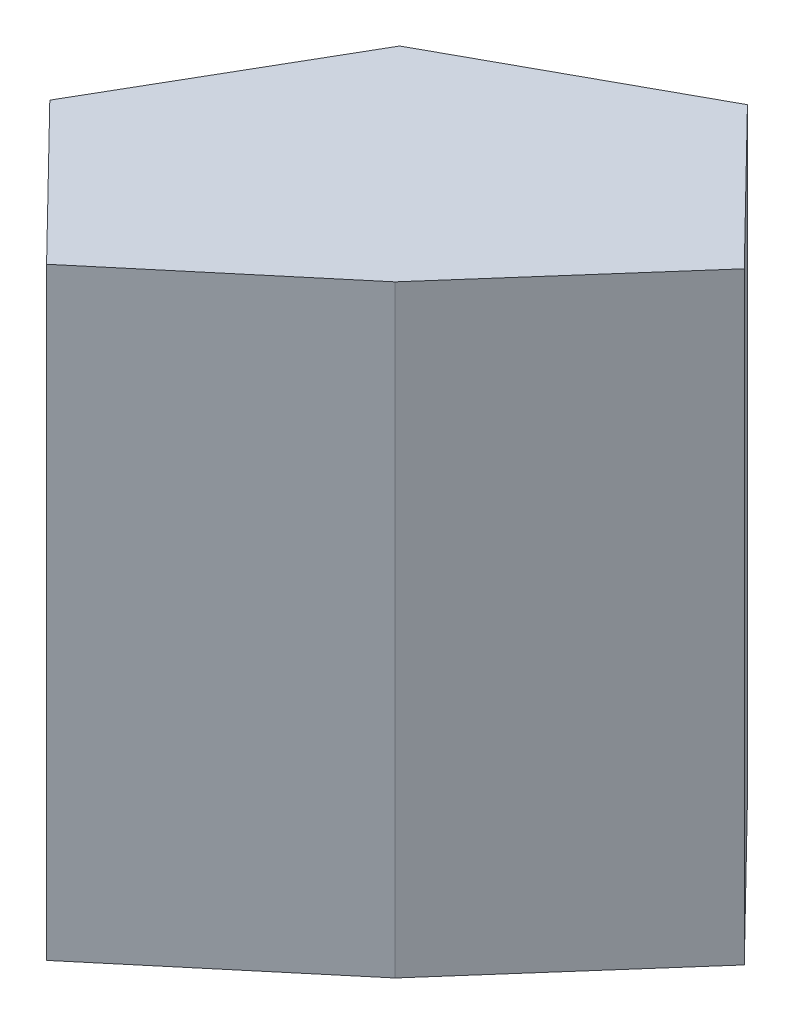
ISO-10303-21;
HEADER;
FILE_DESCRIPTION(('STEP AP214'),'2;1');
FILE_NAME('part.step','',(''),(''),'','','');
FILE_SCHEMA(('AUTOMOTIVE_DESIGN { 1 0 10303 214 1 1 1 1 }'));
ENDSEC;
DATA;
#1=APPLICATION_CONTEXT('core data for automotive mechanical design processes');
#2=APPLICATION_PROTOCOL_DEFINITION('international standard','automotive_design',2000,#1);
#3=PRODUCT_CONTEXT('',#1,'mechanical');
#4=PRODUCT('Part','Part','',(#3));
#5=PRODUCT_RELATED_PRODUCT_CATEGORY('part','',(#4));
#6=PRODUCT_DEFINITION_FORMATION('','',#4);
#7=PRODUCT_DEFINITION_CONTEXT('part definition',#1,'design');
#8=PRODUCT_DEFINITION('design','',#6,#7);
#9=PRODUCT_DEFINITION_SHAPE('','',#8);
#10=(LENGTH_UNIT() NAMED_UNIT(*) SI_UNIT(.MILLI.,.METRE.));
#11=(NAMED_UNIT(*) PLANE_ANGLE_UNIT() SI_UNIT($,.RADIAN.));
#12=(NAMED_UNIT(*) SI_UNIT($,.STERADIAN.) SOLID_ANGLE_UNIT());
#13=UNCERTAINTY_MEASURE_WITH_UNIT(LENGTH_MEASURE(1.E-05),#10,'distance_accuracy_value','');
#14=(GEOMETRIC_REPRESENTATION_CONTEXT(3) GLOBAL_UNCERTAINTY_ASSIGNED_CONTEXT((#13)) GLOBAL_UNIT_ASSIGNED_CONTEXT((#10,
#11,#12)) REPRESENTATION_CONTEXT('',''));
#15=CARTESIAN_POINT('',(0.,0.,0.));
#16=DIRECTION('',(0.,0.,1.));
#17=DIRECTION('',(1.,0.,0.));
#18=AXIS2_PLACEMENT_3D('',#15,#16,#17);
#19=CARTESIAN_POINT('',(13.4345786490416,6.5,-11.2729499894327));
#20=DIRECTION('',(-0.642787609686529,0.,-0.766044443118986));
#21=DIRECTION('',(-0.766044443118986,0.,0.64278760968653));
#22=AXIS2_PLACEMENT_3D('',#19,#20,#21);
#23=PLANE('',#22);
#24=DIRECTION('',(0.766044443118986,0.,-0.64278760968653));
#25=VECTOR('',#24,1.);
#26=CARTESIAN_POINT('',(13.4345786490416,-6.5,-11.2729499894327));
#27=LINE('',#26,#25);
#28=CARTESIAN_POINT('',(9.34793553563478,-6.5,-7.84384926021994));
#29=VERTEX_POINT('',#28);
#30=CARTESIAN_POINT('',(13.4345786490416,-6.5,-11.2729499894327));
#31=VERTEX_POINT('',#30);
#32=EDGE_CURVE('E134',#29,#31,#27,.T.);
#33=ORIENTED_EDGE('',*,*,#32,.T.);
#34=DIRECTION('',(0.,-1.,0.));
#35=VECTOR('',#34,1.);
#36=CARTESIAN_POINT('',(13.4345786490416,6.5,-11.2729499894327));
#37=LINE('',#36,#35);
#38=CARTESIAN_POINT('',(13.4345786490416,6.5,-11.2729499894327));
#39=VERTEX_POINT('',#38);
#40=EDGE_CURVE('E131',#39,#31,#37,.T.);
#41=ORIENTED_EDGE('',*,*,#40,.F.);
#42=DIRECTION('',(0.766044443118986,0.,-0.64278760968653));
#43=VECTOR('',#42,1.);
#44=CARTESIAN_POINT('',(13.4345786490416,6.5,-11.2729499894327));
#45=LINE('',#44,#43);
#46=CARTESIAN_POINT('',(9.34793553563478,6.5,-7.84384926021994));
#47=VERTEX_POINT('',#46);
#48=EDGE_CURVE('E79',#47,#39,#45,.T.);
#49=ORIENTED_EDGE('',*,*,#48,.F.);
#50=DIRECTION('',(0.,-1.,0.));
#51=VECTOR('',#50,1.);
#52=CARTESIAN_POINT('',(9.34793553563478,6.5,-7.84384926021994));
#53=LINE('',#52,#51);
#54=EDGE_CURVE('E47',#47,#29,#53,.T.);
#55=ORIENTED_EDGE('',*,*,#54,.T.);
#56=EDGE_LOOP('',(#33,#41,#49,#55));
#57=FACE_BOUND('',#56,.T.);
#58=ADVANCED_FACE('F39',(#57),#23,.F.);
#59=CARTESIAN_POINT('',(6.31817285672578,6.5,-10.9433963988516));
#60=DIRECTION('',(0.866025403784439,0.,0.5));
#61=DIRECTION('',(0.5,0.,-0.866025403784439));
#62=AXIS2_PLACEMENT_3D('',#59,#60,#61);
#63=PLANE('',#62);
#64=DIRECTION('',(-0.5,0.,0.866025403784439));
#65=VECTOR('',#64,1.);
#66=CARTESIAN_POINT('',(6.31817285672578,-6.5,-10.9433963988516));
#67=LINE('',#66,#65);
#68=CARTESIAN_POINT('',(9.07990030136609,-6.5,-15.726848649626));
#69=VERTEX_POINT('',#68);
#70=CARTESIAN_POINT('',(6.31817285672578,-6.5,-10.9433963988516));
#71=VERTEX_POINT('',#70);
#72=EDGE_CURVE('E69',#69,#71,#67,.T.);
#73=ORIENTED_EDGE('',*,*,#72,.T.);
#74=DIRECTION('',(0.,-1.,0.));
#75=VECTOR('',#74,1.);
#76=CARTESIAN_POINT('',(6.31817285672578,6.5,-10.9433963988516));
#77=LINE('',#76,#75);
#78=CARTESIAN_POINT('',(6.31817285672578,6.5,-10.9433963988516));
#79=VERTEX_POINT('',#78);
#80=EDGE_CURVE('E11',#79,#71,#77,.T.);
#81=ORIENTED_EDGE('',*,*,#80,.F.);
#82=DIRECTION('',(-0.5,0.,0.866025403784439));
#83=VECTOR('',#82,1.);
#84=CARTESIAN_POINT('',(6.31817285672578,6.5,-10.9433963988516));
#85=LINE('',#84,#83);
#86=CARTESIAN_POINT('',(9.07990030136609,6.5,-15.726848649626));
#87=VERTEX_POINT('',#86);
#88=EDGE_CURVE('E136',#87,#79,#85,.T.);
#89=ORIENTED_EDGE('',*,*,#88,.F.);
#90=DIRECTION('',(0.,-1.,0.));
#91=VECTOR('',#90,1.);
#92=CARTESIAN_POINT('',(9.07990030136609,6.5,-15.726848649626));
#93=LINE('',#92,#91);
#94=EDGE_CURVE('E117',#87,#69,#93,.T.);
#95=ORIENTED_EDGE('',*,*,#94,.T.);
#96=EDGE_LOOP('',(#73,#81,#89,#95));
#97=FACE_BOUND('',#96,.T.);
#98=ADVANCED_FACE('F159',(#97),#63,.F.);
#99=CARTESIAN_POINT('',(9.34793553563478,6.5,-7.84384926021994));
#100=DIRECTION('',(0.715111106248219,0.,-0.699010805152859));
#101=DIRECTION('',(-0.699010805152859,0.,-0.715111106248219));
#102=AXIS2_PLACEMENT_3D('',#99,#100,#101);
#103=PLANE('',#102);
#104=DIRECTION('',(0.699010805152859,0.,0.715111106248219));
#105=VECTOR('',#104,1.);
#106=CARTESIAN_POINT('',(9.34793553563478,-6.5,-7.84384926021994));
#107=LINE('',#106,#105);
#108=EDGE_CURVE('E74',#71,#29,#107,.T.);
#109=ORIENTED_EDGE('',*,*,#108,.T.);
#110=ORIENTED_EDGE('',*,*,#54,.F.);
#111=DIRECTION('',(0.699010805152859,0.,0.715111106248219));
#112=VECTOR('',#111,1.);
#113=CARTESIAN_POINT('',(9.34793553563478,6.5,-7.84384926021994));
#114=LINE('',#113,#112);
#115=EDGE_CURVE('E55',#79,#47,#114,.T.);
#116=ORIENTED_EDGE('',*,*,#115,.F.);
#117=ORIENTED_EDGE('',*,*,#80,.T.);
#118=EDGE_LOOP('',(#109,#110,#116,#117));
#119=FACE_BOUND('',#118,.T.);
#120=ADVANCED_FACE('F164',(#119),#103,.F.);
#121=CARTESIAN_POINT('',(0.,6.5,0.));
#122=DIRECTION('',(0.,-1.,0.));
#123=DIRECTION('',(0.,0.,-1.));
#124=AXIS2_PLACEMENT_3D('',#121,#122,#123);
#125=PLANE('',#124);
#126=ORIENTED_EDGE('',*,*,#48,.T.);
#127=DIRECTION('',(-0.659879864941107,0.,0.751371122578788));
#128=VECTOR('',#127,1.);
#129=CARTESIAN_POINT('',(13.4345786490416,6.5,-11.2729499894327));
#130=LINE('',#129,#128);
#131=CARTESIAN_POINT('',(16.9548620085261,6.5,-15.2813148451286));
#132=VERTEX_POINT('',#131);
#133=EDGE_CURVE('E104',#132,#39,#130,.T.);
#134=ORIENTED_EDGE('',*,*,#133,.F.);
#135=DIRECTION('',(0.69918426694831,0.,0.714941508692812));
#136=VECTOR('',#135,1.);
#137=CARTESIAN_POINT('',(16.9548620085261,6.5,-15.2813148451286));
#138=LINE('',#137,#136);
#139=CARTESIAN_POINT('',(13.9243474841947,6.5,-18.3801268873354));
#140=VERTEX_POINT('',#139);
#141=EDGE_CURVE('E97',#140,#132,#138,.T.);
#142=ORIENTED_EDGE('',*,*,#141,.F.);
#143=DIRECTION('',(0.877068298725531,0.,-0.480365693374019));
#144=VECTOR('',#143,1.);
#145=CARTESIAN_POINT('',(13.9243474841947,6.5,-18.3801268873354));
#146=LINE('',#145,#144);
#147=EDGE_CURVE('E101',#87,#140,#146,.T.);
#148=ORIENTED_EDGE('',*,*,#147,.F.);
#149=ORIENTED_EDGE('',*,*,#88,.T.);
#150=ORIENTED_EDGE('',*,*,#115,.T.);
#151=EDGE_LOOP('',(#126,#134,#142,#148,#149,#150));
#152=FACE_BOUND('',#151,.T.);
#153=ADVANCED_FACE('F99',(#152),#125,.F.);
#154=CARTESIAN_POINT('',(0.,-6.5,0.));
#155=DIRECTION('',(0.,-1.,0.));
#156=DIRECTION('',(0.,0.,-1.));
#157=AXIS2_PLACEMENT_3D('',#154,#155,#156);
#158=PLANE('',#157);
#159=ORIENTED_EDGE('',*,*,#32,.F.);
#160=ORIENTED_EDGE('',*,*,#108,.F.);
#161=ORIENTED_EDGE('',*,*,#72,.F.);
#162=DIRECTION('',(0.877068298725531,0.,-0.480365693374019));
#163=VECTOR('',#162,1.);
#164=CARTESIAN_POINT('',(13.9243474841947,-6.5,-18.3801268873354));
#165=LINE('',#164,#163);
#166=CARTESIAN_POINT('',(13.9243474841947,-6.5,-18.3801268873354));
#167=VERTEX_POINT('',#166);
#168=EDGE_CURVE('E126',#69,#167,#165,.T.);
#169=ORIENTED_EDGE('',*,*,#168,.T.);
#170=DIRECTION('',(0.69918426694831,0.,0.714941508692812));
#171=VECTOR('',#170,1.);
#172=CARTESIAN_POINT('',(16.9548620085261,-6.5,-15.2813148451286));
#173=LINE('',#172,#171);
#174=CARTESIAN_POINT('',(16.9548620085261,-6.5,-15.2813148451286));
#175=VERTEX_POINT('',#174);
#176=EDGE_CURVE('E113',#167,#175,#173,.T.);
#177=ORIENTED_EDGE('',*,*,#176,.T.);
#178=DIRECTION('',(-0.659879864941107,0.,0.751371122578788));
#179=VECTOR('',#178,1.);
#180=CARTESIAN_POINT('',(13.4345786490416,-6.5,-11.2729499894327));
#181=LINE('',#180,#179);
#182=EDGE_CURVE('E123',#175,#31,#181,.T.);
#183=ORIENTED_EDGE('',*,*,#182,.T.);
#184=EDGE_LOOP('',(#159,#160,#161,#169,#177,#183));
#185=FACE_BOUND('',#184,.T.);
#186=ADVANCED_FACE('F144',(#185),#158,.T.);
#187=CARTESIAN_POINT('',(13.4345786490416,6.5,-11.2729499894327));
#188=DIRECTION('',(-0.751371122578787,0.,-0.659879864941106));
#189=DIRECTION('',(0.659879864941107,0.,-0.751371122578788));
#190=AXIS2_PLACEMENT_3D('',#187,#188,#189);
#191=PLANE('',#190);
#192=ORIENTED_EDGE('',*,*,#182,.F.);
#193=DIRECTION('',(0.,-1.,0.));
#194=VECTOR('',#193,1.);
#195=CARTESIAN_POINT('',(16.9548620085261,6.5,-15.2813148451286));
#196=LINE('',#195,#194);
#197=EDGE_CURVE('E108',#132,#175,#196,.T.);
#198=ORIENTED_EDGE('',*,*,#197,.F.);
#199=ORIENTED_EDGE('',*,*,#133,.T.);
#200=ORIENTED_EDGE('',*,*,#40,.T.);
#201=EDGE_LOOP('',(#192,#198,#199,#200));
#202=FACE_BOUND('',#201,.T.);
#203=ADVANCED_FACE('F147',(#202),#191,.F.);
#204=CARTESIAN_POINT('',(13.9243474841947,6.5,-18.3801268873354));
#205=DIRECTION('',(0.480365693374019,0.,0.877068298725531));
#206=DIRECTION('',(-0.877068298725531,0.,0.480365693374019));
#207=AXIS2_PLACEMENT_3D('',#204,#205,#206);
#208=PLANE('',#207);
#209=ORIENTED_EDGE('',*,*,#168,.F.);
#210=ORIENTED_EDGE('',*,*,#94,.F.);
#211=ORIENTED_EDGE('',*,*,#147,.T.);
#212=DIRECTION('',(0.,-1.,0.));
#213=VECTOR('',#212,1.);
#214=CARTESIAN_POINT('',(13.9243474841947,6.5,-18.3801268873354));
#215=LINE('',#214,#213);
#216=EDGE_CURVE('E111',#140,#167,#215,.T.);
#217=ORIENTED_EDGE('',*,*,#216,.T.);
#218=EDGE_LOOP('',(#209,#210,#211,#217));
#219=FACE_BOUND('',#218,.T.);
#220=ADVANCED_FACE('F119',(#219),#208,.F.);
#221=CARTESIAN_POINT('',(16.9548620085261,6.5,-15.2813148451286));
#222=DIRECTION('',(-0.714941508692812,0.,0.69918426694831));
#223=DIRECTION('',(-0.69918426694831,0.,-0.714941508692812));
#224=AXIS2_PLACEMENT_3D('',#221,#222,#223);
#225=PLANE('',#224);
#226=ORIENTED_EDGE('',*,*,#176,.F.);
#227=ORIENTED_EDGE('',*,*,#216,.F.);
#228=ORIENTED_EDGE('',*,*,#141,.T.);
#229=ORIENTED_EDGE('',*,*,#197,.T.);
#230=EDGE_LOOP('',(#226,#227,#228,#229));
#231=FACE_BOUND('',#230,.T.);
#232=ADVANCED_FACE('F112',(#231),#225,.F.);
#233=CLOSED_SHELL('',(#58,#98,#120,#153,#186,#203,#220,#232));
#234=MANIFOLD_SOLID_BREP('B2',#233);
#235=ADVANCED_BREP_SHAPE_REPRESENTATION('',(#18,#234),#14);
#236=SHAPE_DEFINITION_REPRESENTATION(#9,#235);
ENDSEC;
END-ISO-10303-21;
